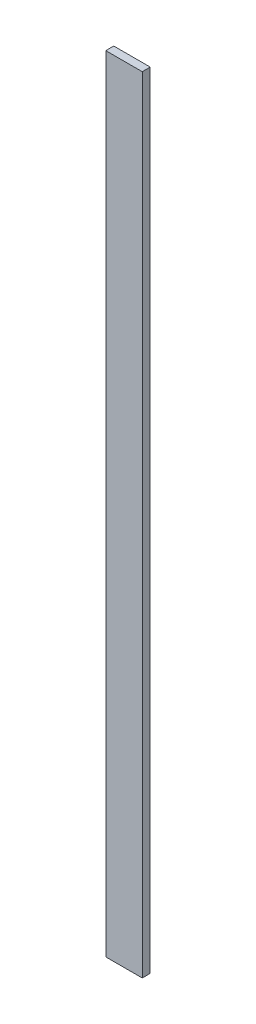
ISO-10303-21;
HEADER;
FILE_DESCRIPTION(('STEP AP214'),'2;1');
FILE_NAME('part.step','',(''),(''),'','','');
FILE_SCHEMA(('AUTOMOTIVE_DESIGN { 1 0 10303 214 1 1 1 1 }'));
ENDSEC;
DATA;
#1=APPLICATION_CONTEXT('core data for automotive mechanical design processes');
#2=APPLICATION_PROTOCOL_DEFINITION('international standard','automotive_design',2000,#1);
#3=PRODUCT_CONTEXT('',#1,'mechanical');
#4=PRODUCT('Part','Part','',(#3));
#5=PRODUCT_RELATED_PRODUCT_CATEGORY('part','',(#4));
#6=PRODUCT_DEFINITION_FORMATION('','',#4);
#7=PRODUCT_DEFINITION_CONTEXT('part definition',#1,'design');
#8=PRODUCT_DEFINITION('design','',#6,#7);
#9=PRODUCT_DEFINITION_SHAPE('','',#8);
#10=(LENGTH_UNIT() NAMED_UNIT(*) SI_UNIT(.MILLI.,.METRE.));
#11=(NAMED_UNIT(*) PLANE_ANGLE_UNIT() SI_UNIT($,.RADIAN.));
#12=(NAMED_UNIT(*) SI_UNIT($,.STERADIAN.) SOLID_ANGLE_UNIT());
#13=UNCERTAINTY_MEASURE_WITH_UNIT(LENGTH_MEASURE(1.E-05),#10,'distance_accuracy_value','');
#14=(GEOMETRIC_REPRESENTATION_CONTEXT(3) GLOBAL_UNCERTAINTY_ASSIGNED_CONTEXT((#13)) GLOBAL_UNIT_ASSIGNED_CONTEXT((#10,
#11,#12)) REPRESENTATION_CONTEXT('',''));
#15=CARTESIAN_POINT('',(0.,0.,0.));
#16=DIRECTION('',(0.,0.,1.));
#17=DIRECTION('',(1.,0.,0.));
#18=AXIS2_PLACEMENT_3D('',#15,#16,#17);
#19=CARTESIAN_POINT('',(41.671875,-896.143750000001,18.25625));
#20=DIRECTION('',(-1.,0.,0.));
#21=DIRECTION('',(0.,0.,1.));
#22=AXIS2_PLACEMENT_3D('',#19,#20,#21);
#23=PLANE('',#22);
#24=DIRECTION('',(0.,1.,0.));
#25=VECTOR('',#24,1.);
#26=CARTESIAN_POINT('',(41.671875,-896.143750000001,0.));
#27=LINE('',#26,#25);
#28=CARTESIAN_POINT('',(41.671875,-896.143750000001,0.));
#29=VERTEX_POINT('',#28);
#30=CARTESIAN_POINT('',(41.671875,896.143749999999,0.));
#31=VERTEX_POINT('',#30);
#32=EDGE_CURVE('E107',#29,#31,#27,.T.);
#33=ORIENTED_EDGE('',*,*,#32,.T.);
#34=DIRECTION('',(0.,0.,-1.));
#35=VECTOR('',#34,1.);
#36=CARTESIAN_POINT('',(41.671875,896.143749999999,18.25625));
#37=LINE('',#36,#35);
#38=CARTESIAN_POINT('',(41.671875,896.143749999999,18.25625));
#39=VERTEX_POINT('',#38);
#40=EDGE_CURVE('E11',#39,#31,#37,.T.);
#41=ORIENTED_EDGE('',*,*,#40,.F.);
#42=DIRECTION('',(0.,1.,0.));
#43=VECTOR('',#42,1.);
#44=CARTESIAN_POINT('',(41.671875,-896.143750000001,18.25625));
#45=LINE('',#44,#43);
#46=CARTESIAN_POINT('',(41.671875,-896.143750000001,18.25625));
#47=VERTEX_POINT('',#46);
#48=EDGE_CURVE('E91',#47,#39,#45,.T.);
#49=ORIENTED_EDGE('',*,*,#48,.F.);
#50=DIRECTION('',(0.,0.,-1.));
#51=VECTOR('',#50,1.);
#52=CARTESIAN_POINT('',(41.671875,-896.143750000001,18.25625));
#53=LINE('',#52,#51);
#54=EDGE_CURVE('E103',#47,#29,#53,.T.);
#55=ORIENTED_EDGE('',*,*,#54,.T.);
#56=EDGE_LOOP('',(#33,#41,#49,#55));
#57=FACE_BOUND('',#56,.T.);
#58=ADVANCED_FACE('F39',(#57),#23,.F.);
#59=CARTESIAN_POINT('',(-41.671875,896.143749999999,18.25625));
#60=DIRECTION('',(0.,-1.,0.));
#61=DIRECTION('',(0.,0.,-1.));
#62=AXIS2_PLACEMENT_3D('',#59,#60,#61);
#63=PLANE('',#62);
#64=DIRECTION('',(-1.,0.,0.));
#65=VECTOR('',#64,1.);
#66=CARTESIAN_POINT('',(-41.671875,896.143749999999,0.));
#67=LINE('',#66,#65);
#68=CARTESIAN_POINT('',(-41.671875,896.143749999999,0.));
#69=VERTEX_POINT('',#68);
#70=EDGE_CURVE('E96',#31,#69,#67,.T.);
#71=ORIENTED_EDGE('',*,*,#70,.T.);
#72=DIRECTION('',(0.,0.,-1.));
#73=VECTOR('',#72,1.);
#74=CARTESIAN_POINT('',(-41.671875,896.143749999999,18.25625));
#75=LINE('',#74,#73);
#76=CARTESIAN_POINT('',(-41.671875,896.143749999999,18.25625));
#77=VERTEX_POINT('',#76);
#78=EDGE_CURVE('E48',#77,#69,#75,.T.);
#79=ORIENTED_EDGE('',*,*,#78,.F.);
#80=DIRECTION('',(-1.,0.,0.));
#81=VECTOR('',#80,1.);
#82=CARTESIAN_POINT('',(-41.671875,896.143749999999,18.25625));
#83=LINE('',#82,#81);
#84=EDGE_CURVE('E86',#39,#77,#83,.T.);
#85=ORIENTED_EDGE('',*,*,#84,.F.);
#86=ORIENTED_EDGE('',*,*,#40,.T.);
#87=EDGE_LOOP('',(#71,#79,#85,#86));
#88=FACE_BOUND('',#87,.T.);
#89=ADVANCED_FACE('F95',(#88),#63,.F.);
#90=CARTESIAN_POINT('',(-41.671875,-896.143750000001,18.25625));
#91=DIRECTION('',(1.,0.,0.));
#92=DIRECTION('',(0.,0.,-1.));
#93=AXIS2_PLACEMENT_3D('',#90,#91,#92);
#94=PLANE('',#93);
#95=DIRECTION('',(0.,-1.,0.));
#96=VECTOR('',#95,1.);
#97=CARTESIAN_POINT('',(-41.671875,-896.143750000001,0.));
#98=LINE('',#97,#96);
#99=CARTESIAN_POINT('',(-41.671875,-896.143750000001,0.));
#100=VERTEX_POINT('',#99);
#101=EDGE_CURVE('E73',#69,#100,#98,.T.);
#102=ORIENTED_EDGE('',*,*,#101,.T.);
#103=DIRECTION('',(0.,0.,-1.));
#104=VECTOR('',#103,1.);
#105=CARTESIAN_POINT('',(-41.671875,-896.143750000001,18.25625));
#106=LINE('',#105,#104);
#107=CARTESIAN_POINT('',(-41.671875,-896.143750000001,18.25625));
#108=VERTEX_POINT('',#107);
#109=EDGE_CURVE('E98',#108,#100,#106,.T.);
#110=ORIENTED_EDGE('',*,*,#109,.F.);
#111=DIRECTION('',(0.,-1.,0.));
#112=VECTOR('',#111,1.);
#113=CARTESIAN_POINT('',(-41.671875,-896.143750000001,18.25625));
#114=LINE('',#113,#112);
#115=EDGE_CURVE('E89',#77,#108,#114,.T.);
#116=ORIENTED_EDGE('',*,*,#115,.F.);
#117=ORIENTED_EDGE('',*,*,#78,.T.);
#118=EDGE_LOOP('',(#102,#110,#116,#117));
#119=FACE_BOUND('',#118,.T.);
#120=ADVANCED_FACE('F99',(#119),#94,.F.);
#121=CARTESIAN_POINT('',(-41.671875,-896.143750000001,18.25625));
#122=DIRECTION('',(0.,1.,0.));
#123=DIRECTION('',(0.,0.,1.));
#124=AXIS2_PLACEMENT_3D('',#121,#122,#123);
#125=PLANE('',#124);
#126=DIRECTION('',(1.,0.,0.));
#127=VECTOR('',#126,1.);
#128=CARTESIAN_POINT('',(-41.671875,-896.143750000001,0.));
#129=LINE('',#128,#127);
#130=EDGE_CURVE('E79',#100,#29,#129,.T.);
#131=ORIENTED_EDGE('',*,*,#130,.T.);
#132=ORIENTED_EDGE('',*,*,#54,.F.);
#133=DIRECTION('',(1.,0.,0.));
#134=VECTOR('',#133,1.);
#135=CARTESIAN_POINT('',(-41.671875,-896.143750000001,18.25625));
#136=LINE('',#135,#134);
#137=EDGE_CURVE('E56',#108,#47,#136,.T.);
#138=ORIENTED_EDGE('',*,*,#137,.F.);
#139=ORIENTED_EDGE('',*,*,#109,.T.);
#140=EDGE_LOOP('',(#131,#132,#138,#139));
#141=FACE_BOUND('',#140,.T.);
#142=ADVANCED_FACE('F120',(#141),#125,.F.);
#143=CARTESIAN_POINT('',(0.,0.,18.25625));
#144=DIRECTION('',(0.,0.,-1.));
#145=DIRECTION('',(-1.,0.,0.));
#146=AXIS2_PLACEMENT_3D('',#143,#144,#145);
#147=PLANE('',#146);
#148=ORIENTED_EDGE('',*,*,#48,.T.);
#149=ORIENTED_EDGE('',*,*,#84,.T.);
#150=ORIENTED_EDGE('',*,*,#115,.T.);
#151=ORIENTED_EDGE('',*,*,#137,.T.);
#152=EDGE_LOOP('',(#148,#149,#150,#151));
#153=FACE_BOUND('',#152,.T.);
#154=ADVANCED_FACE('F87',(#153),#147,.F.);
#155=CARTESIAN_POINT('',(0.,0.,0.));
#156=DIRECTION('',(0.,0.,-1.));
#157=DIRECTION('',(-1.,0.,0.));
#158=AXIS2_PLACEMENT_3D('',#155,#156,#157);
#159=PLANE('',#158);
#160=ORIENTED_EDGE('',*,*,#32,.F.);
#161=ORIENTED_EDGE('',*,*,#130,.F.);
#162=ORIENTED_EDGE('',*,*,#101,.F.);
#163=ORIENTED_EDGE('',*,*,#70,.F.);
#164=EDGE_LOOP('',(#160,#161,#162,#163));
#165=FACE_BOUND('',#164,.T.);
#166=ADVANCED_FACE('F123',(#165),#159,.T.);
#167=CLOSED_SHELL('',(#58,#89,#120,#142,#154,#166));
#168=MANIFOLD_SOLID_BREP('B2',#167);
#169=ADVANCED_BREP_SHAPE_REPRESENTATION('',(#18,#168),#14);
#170=SHAPE_DEFINITION_REPRESENTATION(#9,#169);
ENDSEC;
END-ISO-10303-21;
